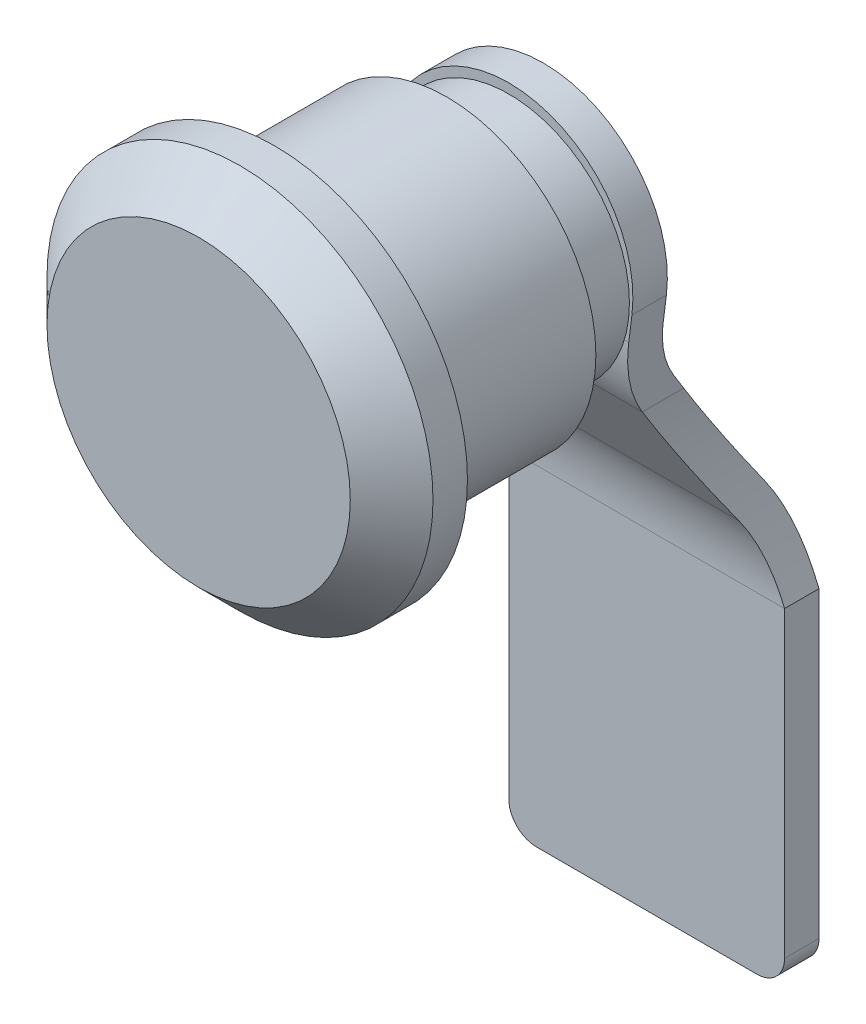
ISO-10303-21;
HEADER;
FILE_DESCRIPTION(('STEP AP214'),'2;1');
FILE_NAME('part.step','',(''),(''),'','','');
FILE_SCHEMA(('AUTOMOTIVE_DESIGN { 1 0 10303 214 1 1 1 1 }'));
ENDSEC;
DATA;
#1=APPLICATION_CONTEXT('core data for automotive mechanical design processes');
#2=APPLICATION_PROTOCOL_DEFINITION('international standard','automotive_design',2000,#1);
#3=PRODUCT_CONTEXT('',#1,'mechanical');
#4=PRODUCT('Part','Part','',(#3));
#5=PRODUCT_RELATED_PRODUCT_CATEGORY('part','',(#4));
#6=PRODUCT_DEFINITION_FORMATION('','',#4);
#7=PRODUCT_DEFINITION_CONTEXT('part definition',#1,'design');
#8=PRODUCT_DEFINITION('design','',#6,#7);
#9=PRODUCT_DEFINITION_SHAPE('','',#8);
#10=(LENGTH_UNIT() NAMED_UNIT(*) SI_UNIT(.MILLI.,.METRE.));
#11=(NAMED_UNIT(*) PLANE_ANGLE_UNIT() SI_UNIT($,.RADIAN.));
#12=(NAMED_UNIT(*) SI_UNIT($,.STERADIAN.) SOLID_ANGLE_UNIT());
#13=UNCERTAINTY_MEASURE_WITH_UNIT(LENGTH_MEASURE(1.E-05),#10,'distance_accuracy_value','');
#14=(GEOMETRIC_REPRESENTATION_CONTEXT(3) GLOBAL_UNCERTAINTY_ASSIGNED_CONTEXT((#13)) GLOBAL_UNIT_ASSIGNED_CONTEXT((#10,
#11,#12)) REPRESENTATION_CONTEXT('',''));
#15=CARTESIAN_POINT('',(0.,0.,0.));
#16=DIRECTION('',(0.,0.,1.));
#17=DIRECTION('',(1.,0.,0.));
#18=AXIS2_PLACEMENT_3D('',#15,#16,#17);
#19=CARTESIAN_POINT('',(0.,47.55,14.5));
#20=DIRECTION('',(0.,0.,-1.));
#21=DIRECTION('',(-1.,0.,0.));
#22=AXIS2_PLACEMENT_3D('',#19,#20,#21);
#23=CYLINDRICAL_SURFACE('',#22,8.75);
#24=CARTESIAN_POINT('',(0.,47.55,14.5));
#25=DIRECTION('',(0.,0.,1.));
#26=DIRECTION('',(1.,0.,0.));
#27=AXIS2_PLACEMENT_3D('',#24,#25,#26);
#28=CIRCLE('',#27,8.75);
#29=CARTESIAN_POINT('',(8.75,47.55,14.5));
#30=VERTEX_POINT('',#29);
#31=EDGE_CURVE('E92',#30,#30,#28,.T.);
#32=ORIENTED_EDGE('',*,*,#31,.F.);
#33=EDGE_LOOP('',(#32));
#34=FACE_BOUND('',#33,.T.);
#35=CARTESIAN_POINT('',(0.,47.55,10.));
#36=DIRECTION('',(0.,0.,1.));
#37=DIRECTION('',(1.,0.,0.));
#38=AXIS2_PLACEMENT_3D('',#35,#36,#37);
#39=CIRCLE('',#38,8.75);
#40=CARTESIAN_POINT('',(8.75,47.55,10.));
#41=VERTEX_POINT('',#40);
#42=EDGE_CURVE('E93',#41,#41,#39,.T.);
#43=ORIENTED_EDGE('',*,*,#42,.T.);
#44=EDGE_LOOP('',(#43));
#45=FACE_BOUND('',#44,.T.);
#46=ADVANCED_FACE('F79',(#34,#45),#23,.T.);
#47=CARTESIAN_POINT('',(0.,47.55,10.));
#48=DIRECTION('',(0.,0.,1.));
#49=DIRECTION('',(1.,0.,0.));
#50=AXIS2_PLACEMENT_3D('',#47,#48,#49);
#51=PLANE('',#50);
#52=ORIENTED_EDGE('',*,*,#42,.F.);
#53=EDGE_LOOP('',(#52));
#54=FACE_BOUND('',#53,.T.);
#55=ADVANCED_FACE('F126',(#54),#51,.F.);
#56=CARTESIAN_POINT('',(0.,47.55,27.));
#57=DIRECTION('',(0.,0.,-1.));
#58=DIRECTION('',(-1.,0.,0.));
#59=AXIS2_PLACEMENT_3D('',#56,#57,#58);
#60=CYLINDRICAL_SURFACE('',#59,10.815);
#61=CARTESIAN_POINT('',(0.,47.55,27.));
#62=DIRECTION('',(0.,0.,1.));
#63=DIRECTION('',(1.,0.,0.));
#64=AXIS2_PLACEMENT_3D('',#61,#62,#63);
#65=CIRCLE('',#64,10.815);
#66=CARTESIAN_POINT('',(10.815,47.55,27.));
#67=VERTEX_POINT('',#66);
#68=EDGE_CURVE('E100',#67,#67,#65,.T.);
#69=ORIENTED_EDGE('',*,*,#68,.F.);
#70=EDGE_LOOP('',(#69));
#71=FACE_BOUND('',#70,.T.);
#72=CARTESIAN_POINT('',(0.,47.55,14.5));
#73=DIRECTION('',(0.,0.,1.));
#74=DIRECTION('',(1.,0.,0.));
#75=AXIS2_PLACEMENT_3D('',#72,#73,#74);
#76=CIRCLE('',#75,10.815);
#77=CARTESIAN_POINT('',(10.815,47.55,14.5));
#78=VERTEX_POINT('',#77);
#79=EDGE_CURVE('E103',#78,#78,#76,.T.);
#80=ORIENTED_EDGE('',*,*,#79,.T.);
#81=EDGE_LOOP('',(#80));
#82=FACE_BOUND('',#81,.T.);
#83=ADVANCED_FACE('F135',(#71,#82),#60,.T.);
#84=CARTESIAN_POINT('',(0.,47.55,14.5));
#85=DIRECTION('',(0.,0.,1.));
#86=DIRECTION('',(1.,0.,0.));
#87=AXIS2_PLACEMENT_3D('',#84,#85,#86);
#88=PLANE('',#87);
#89=ORIENTED_EDGE('',*,*,#31,.T.);
#90=EDGE_LOOP('',(#89));
#91=FACE_BOUND('',#90,.T.);
#92=ORIENTED_EDGE('',*,*,#79,.F.);
#93=EDGE_LOOP('',(#92));
#94=FACE_BOUND('',#93,.T.);
#95=ADVANCED_FACE('F138',(#91,#94),#88,.F.);
#96=CARTESIAN_POINT('',(0.,47.55,32.5));
#97=DIRECTION('',(0.,0.,-1.));
#98=DIRECTION('',(-1.,0.,0.));
#99=AXIS2_PLACEMENT_3D('',#96,#97,#98);
#100=CYLINDRICAL_SURFACE('',#99,14.);
#101=CARTESIAN_POINT('',(0.,47.55,29.5));
#102=DIRECTION('',(0.,0.,1.));
#103=DIRECTION('',(1.,0.,0.));
#104=AXIS2_PLACEMENT_3D('',#101,#102,#103);
#105=CIRCLE('',#104,14.);
#106=CARTESIAN_POINT('',(14.,47.55,29.5));
#107=VERTEX_POINT('',#106);
#108=EDGE_CURVE('E12',#107,#107,#105,.F.);
#109=ORIENTED_EDGE('',*,*,#108,.T.);
#110=EDGE_LOOP('',(#109));
#111=FACE_BOUND('',#110,.T.);
#112=CARTESIAN_POINT('',(0.,47.55,27.));
#113=DIRECTION('',(0.,0.,1.));
#114=DIRECTION('',(1.,0.,0.));
#115=AXIS2_PLACEMENT_3D('',#112,#113,#114);
#116=CIRCLE('',#115,14.);
#117=CARTESIAN_POINT('',(14.,47.55,27.));
#118=VERTEX_POINT('',#117);
#119=EDGE_CURVE('E104',#118,#118,#116,.T.);
#120=ORIENTED_EDGE('',*,*,#119,.T.);
#121=EDGE_LOOP('',(#120));
#122=FACE_BOUND('',#121,.T.);
#123=ADVANCED_FACE('F109',(#111,#122),#100,.T.);
#124=CARTESIAN_POINT('',(0.,47.55,32.5));
#125=DIRECTION('',(0.,0.,1.));
#126=DIRECTION('',(1.,0.,0.));
#127=AXIS2_PLACEMENT_3D('',#124,#125,#126);
#128=PLANE('',#127);
#129=CARTESIAN_POINT('',(0.,47.55,32.5));
#130=DIRECTION('',(0.,0.,1.));
#131=DIRECTION('',(1.,0.,0.));
#132=AXIS2_PLACEMENT_3D('',#129,#130,#131);
#133=CIRCLE('',#132,11.);
#134=CARTESIAN_POINT('',(11.,47.55,32.5));
#135=VERTEX_POINT('',#134);
#136=EDGE_CURVE('E90',#135,#135,#133,.T.);
#137=ORIENTED_EDGE('',*,*,#136,.T.);
#138=EDGE_LOOP('',(#137));
#139=FACE_BOUND('',#138,.T.);
#140=ADVANCED_FACE('F112',(#139),#128,.T.);
#141=CARTESIAN_POINT('',(0.,47.55,27.));
#142=DIRECTION('',(0.,0.,1.));
#143=DIRECTION('',(1.,0.,0.));
#144=AXIS2_PLACEMENT_3D('',#141,#142,#143);
#145=PLANE('',#144);
#146=ORIENTED_EDGE('',*,*,#68,.T.);
#147=EDGE_LOOP('',(#146));
#148=FACE_BOUND('',#147,.T.);
#149=ORIENTED_EDGE('',*,*,#119,.F.);
#150=EDGE_LOOP('',(#149));
#151=FACE_BOUND('',#150,.T.);
#152=ADVANCED_FACE('F115',(#148,#151),#145,.F.);
#153=CARTESIAN_POINT('',(0.,47.55,32.5));
#154=DIRECTION('',(0.,0.,-1.));
#155=DIRECTION('',(-1.,0.,0.));
#156=AXIS2_PLACEMENT_3D('',#153,#154,#155);
#157=CONICAL_SURFACE('',#156,11.,0.785398163397447);
#158=ORIENTED_EDGE('',*,*,#108,.F.);
#159=EDGE_LOOP('',(#158));
#160=FACE_BOUND('',#159,.T.);
#161=ORIENTED_EDGE('',*,*,#136,.F.);
#162=EDGE_LOOP('',(#161));
#163=FACE_BOUND('',#162,.T.);
#164=ADVANCED_FACE('F81',(#160,#163),#157,.T.);
#165=CLOSED_SHELL('',(#46,#55,#83,#95,#123,#140,#152,#164));
#166=MANIFOLD_SOLID_BREP('B2',#165);
#167=CARTESIAN_POINT('',(10.,45.0277563773199,7.5));
#168=DIRECTION('',(0.,0.,-1.));
#169=DIRECTION('',(-1.,0.,0.));
#170=AXIS2_PLACEMENT_3D('',#167,#168,#169);
#171=PLANE('',#170);
#172=DIRECTION('',(0.,1.,0.));
#173=VECTOR('',#172,1.);
#174=CARTESIAN_POINT('',(-4.75,45.0277563773199,7.5));
#175=LINE('',#174,#173);
#176=CARTESIAN_POINT('',(-4.75,45.0277563773199,7.5));
#177=VERTEX_POINT('',#176);
#178=CARTESIAN_POINT('',(-4.75,52.3,7.5));
#179=VERTEX_POINT('',#178);
#180=EDGE_CURVE('E376',#177,#179,#175,.T.);
#181=ORIENTED_EDGE('',*,*,#180,.F.);
#182=DIRECTION('',(-1.,0.,0.));
#183=VECTOR('',#182,1.);
#184=CARTESIAN_POINT('',(10.,45.0277563773199,7.5));
#185=LINE('',#184,#183);
#186=CARTESIAN_POINT('',(-8.69722392769343,45.0277563773199,7.5));
#187=VERTEX_POINT('',#186);
#188=EDGE_CURVE('E483',#177,#187,#185,.T.);
#189=ORIENTED_EDGE('',*,*,#188,.T.);
#190=DIRECTION('',(-0.124712528953601,0.992192917290784,0.));
#191=VECTOR('',#190,1.);
#192=CARTESIAN_POINT('',(-8.40642198632387,42.714182681219,7.5));
#193=LINE('',#192,#191);
#194=CARTESIAN_POINT('',(-8.92973625561706,46.8775872394176,7.5));
#195=VERTEX_POINT('',#194);
#196=EDGE_CURVE('E391',#187,#195,#193,.T.);
#197=ORIENTED_EDGE('',*,*,#196,.T.);
#198=CARTESIAN_POINT('',(0.,48.,7.5));
#199=DIRECTION('',(0.,0.,-1.));
#200=DIRECTION('',(-1.,0.,0.));
#201=AXIS2_PLACEMENT_3D('',#198,#199,#200);
#202=CIRCLE('',#201,9.);
#203=CARTESIAN_POINT('',(8.92973625561706,46.8775872394176,7.5));
#204=VERTEX_POINT('',#203);
#205=EDGE_CURVE('E553',#195,#204,#202,.T.);
#206=ORIENTED_EDGE('',*,*,#205,.T.);
#207=DIRECTION('',(0.124712528953601,0.992192917290784,0.));
#208=VECTOR('',#207,1.);
#209=CARTESIAN_POINT('',(8.71748628388393,45.1889604397227,7.5));
#210=LINE('',#209,#208);
#211=CARTESIAN_POINT('',(8.69722392769343,45.0277563773199,7.5));
#212=VERTEX_POINT('',#211);
#213=EDGE_CURVE('E498',#212,#204,#210,.T.);
#214=ORIENTED_EDGE('',*,*,#213,.F.);
#215=CARTESIAN_POINT('',(4.75,45.0277563773199,7.5));
#216=VERTEX_POINT('',#215);
#217=EDGE_CURVE('E482',#212,#216,#185,.T.);
#218=ORIENTED_EDGE('',*,*,#217,.T.);
#219=DIRECTION('',(0.,-1.,0.));
#220=VECTOR('',#219,1.);
#221=CARTESIAN_POINT('',(4.75,45.0277563773199,7.5));
#222=LINE('',#221,#220);
#223=CARTESIAN_POINT('',(4.75,52.3,7.5));
#224=VERTEX_POINT('',#223);
#225=EDGE_CURVE('E375',#224,#216,#222,.T.);
#226=ORIENTED_EDGE('',*,*,#225,.F.);
#227=DIRECTION('',(1.,0.,0.));
#228=VECTOR('',#227,1.);
#229=CARTESIAN_POINT('',(10.,52.3,7.5));
#230=LINE('',#229,#228);
#231=EDGE_CURVE('E350',#179,#224,#230,.T.);
#232=ORIENTED_EDGE('',*,*,#231,.F.);
#233=EDGE_LOOP('',(#181,#189,#197,#206,#214,#218,#226,#232));
#234=FACE_BOUND('',#233,.T.);
#235=ADVANCED_FACE('F196',(#234),#171,.T.);
#236=CARTESIAN_POINT('',(10.,45.0277563773199,10.));
#237=DIRECTION('',(0.,0.,1.));
#238=DIRECTION('',(1.,0.,0.));
#239=AXIS2_PLACEMENT_3D('',#236,#237,#238);
#240=PLANE('',#239);
#241=DIRECTION('',(0.,-1.,0.));
#242=VECTOR('',#241,1.);
#243=CARTESIAN_POINT('',(-4.75,52.3,10.));
#244=LINE('',#243,#242);
#245=CARTESIAN_POINT('',(-4.75,52.3,10.));
#246=VERTEX_POINT('',#245);
#247=CARTESIAN_POINT('',(-4.75,45.0277563773199,10.));
#248=VERTEX_POINT('',#247);
#249=EDGE_CURVE('E356',#246,#248,#244,.T.);
#250=ORIENTED_EDGE('',*,*,#249,.F.);
#251=DIRECTION('',(-1.,0.,0.));
#252=VECTOR('',#251,1.);
#253=CARTESIAN_POINT('',(-4.75,52.3,10.));
#254=LINE('',#253,#252);
#255=CARTESIAN_POINT('',(4.75,52.3,10.));
#256=VERTEX_POINT('',#255);
#257=EDGE_CURVE('E343',#256,#246,#254,.T.);
#258=ORIENTED_EDGE('',*,*,#257,.F.);
#259=DIRECTION('',(0.,1.,0.));
#260=VECTOR('',#259,1.);
#261=CARTESIAN_POINT('',(4.75,52.3,10.));
#262=LINE('',#261,#260);
#263=CARTESIAN_POINT('',(4.75,45.0277563773199,10.));
#264=VERTEX_POINT('',#263);
#265=EDGE_CURVE('E354',#264,#256,#262,.T.);
#266=ORIENTED_EDGE('',*,*,#265,.F.);
#267=DIRECTION('',(1.,0.,0.));
#268=VECTOR('',#267,1.);
#269=CARTESIAN_POINT('',(10.,45.0277563773199,10.));
#270=LINE('',#269,#268);
#271=CARTESIAN_POINT('',(8.69722392769343,45.0277563773199,10.));
#272=VERTEX_POINT('',#271);
#273=EDGE_CURVE('E481',#264,#272,#270,.T.);
#274=ORIENTED_EDGE('',*,*,#273,.T.);
#275=DIRECTION('',(-0.124712528953601,-0.992192917290784,0.));
#276=VECTOR('',#275,1.);
#277=CARTESIAN_POINT('',(2.99026963520817,-0.375858446438275,10.));
#278=LINE('',#277,#276);
#279=CARTESIAN_POINT('',(8.92973625561706,46.8775872394176,10.));
#280=VERTEX_POINT('',#279);
#281=EDGE_CURVE('E537',#280,#272,#278,.T.);
#282=ORIENTED_EDGE('',*,*,#281,.F.);
#283=CARTESIAN_POINT('',(0.,48.,10.));
#284=DIRECTION('',(0.,0.,1.));
#285=DIRECTION('',(1.,0.,0.));
#286=AXIS2_PLACEMENT_3D('',#283,#284,#285);
#287=CIRCLE('',#286,9.);
#288=CARTESIAN_POINT('',(-8.92973625561706,46.8775872394176,10.));
#289=VERTEX_POINT('',#288);
#290=EDGE_CURVE('E435',#280,#289,#287,.T.);
#291=ORIENTED_EDGE('',*,*,#290,.T.);
#292=DIRECTION('',(0.124712528953601,-0.992192917290784,0.));
#293=VECTOR('',#292,1.);
#294=CARTESIAN_POINT('',(-2.99026963520817,-0.375858446438275,10.));
#295=LINE('',#294,#293);
#296=CARTESIAN_POINT('',(-8.69722392769343,45.0277563773199,10.));
#297=VERTEX_POINT('',#296);
#298=EDGE_CURVE('E378',#289,#297,#295,.T.);
#299=ORIENTED_EDGE('',*,*,#298,.T.);
#300=EDGE_CURVE('E496',#297,#248,#270,.T.);
#301=ORIENTED_EDGE('',*,*,#300,.T.);
#302=EDGE_LOOP('',(#250,#258,#266,#274,#282,#291,#299,#301));
#303=FACE_BOUND('',#302,.T.);
#304=ADVANCED_FACE('F359',(#303),#240,.T.);
#305=CARTESIAN_POINT('',(0.,23.9722436226801,10.));
#306=DIRECTION('',(1.,0.,0.));
#307=DIRECTION('',(0.,0.,-1.));
#308=AXIS2_PLACEMENT_3D('',#305,#306,#307);
#309=CYLINDRICAL_SURFACE('',#308,12.5);
#310=DIRECTION('',(-1.,0.,0.));
#311=VECTOR('',#310,1.);
#312=CARTESIAN_POINT('',(10.,23.97224362268,-2.5));
#313=LINE('',#312,#311);
#314=CARTESIAN_POINT('',(10.,23.97224362268,-2.5));
#315=VERTEX_POINT('',#314);
#316=CARTESIAN_POINT('',(-10.,23.97224362268,-2.5));
#317=VERTEX_POINT('',#316);
#318=EDGE_CURVE('E465',#315,#317,#313,.T.);
#319=ORIENTED_EDGE('',*,*,#318,.T.);
#320=CARTESIAN_POINT('',(-10.,23.97224362268,-2.5));
#321=CARTESIAN_POINT('',(-9.93490756182299,24.1344819645482,-2.49999977143485));
#322=CARTESIAN_POINT('',(-9.87118805263804,24.2972527151614,-2.49684075597756));
#323=CARTESIAN_POINT('',(-9.74656835922448,24.6236316161997,-2.48408494208752));
#324=CARTESIAN_POINT('',(-9.68566837600438,24.7872398254078,-2.47448768541545));
#325=CARTESIAN_POINT('',(-9.50729439464097,25.2790195403591,-2.43585299479659));
#326=CARTESIAN_POINT('',(-9.39417616928577,25.6080718079003,-2.39697253004292));
#327=CARTESIAN_POINT('',(-9.18296304180481,26.2572599729211,-2.29365426204652));
#328=CARTESIAN_POINT('',(-9.08455340010249,26.5774047159925,-2.22990904795546));
#329=CARTESIAN_POINT('',(-8.89961404933422,27.2148473250927,-2.07654373595993));
#330=CARTESIAN_POINT('',(-8.81308066014814,27.5321460444108,-1.98693168030128));
#331=CARTESIAN_POINT('',(-8.66483416703809,28.1108006646216,-1.79828495352514));
#332=CARTESIAN_POINT('',(-8.60136656174937,28.3729611862488,-1.70307146308777));
#333=CARTESIAN_POINT('',(-8.48265835773092,28.8919044784615,-1.49456949715528));
#334=CARTESIAN_POINT('',(-8.42741745691517,29.1486874462139,-1.38128168566896));
#335=CARTESIAN_POINT('',(-8.32376080753186,29.6609789487687,-1.13422229002246));
#336=CARTESIAN_POINT('',(-8.27552551471736,29.9163302924956,-1.00004895348743));
#337=CARTESIAN_POINT('',(-8.18694350252523,30.4182005943638,-0.713698273211968));
#338=CARTESIAN_POINT('',(-8.14659789882116,30.6647182993288,-0.561518388058976));
#339=CARTESIAN_POINT('',(-8.10998146575407,30.9059960754955,-0.400628679223022));
#340=B_SPLINE_CURVE_WITH_KNOTS('',3,(#320,#321,#322,#323,#324,#325,#326,#327,#328,#329,#330,
#331,#332,#333,#334,#335,#336,#337,#338,#339),.UNSPECIFIED.,.F.,.F.,(4,2,2,2,2,2,2,2,2,4),(0.,
0.524356550499981,1.04875042583385,2.09777769206142,3.11946121264182,4.14082742366034,
4.99825307297295,5.85564722969835,6.73223361565664,7.60894386938037),.UNSPECIFIED.);
#341=CARTESIAN_POINT('',(-8.10998146575407,30.9059960754955,-0.400628679223021));
#342=VERTEX_POINT('',#341);
#343=EDGE_CURVE('E425',#317,#342,#340,.T.);
#344=ORIENTED_EDGE('',*,*,#343,.T.);
#345=DIRECTION('',(-1.,0.,0.));
#346=VECTOR('',#345,1.);
#347=CARTESIAN_POINT('',(10.,30.9059960754955,-0.400628679223021));
#348=LINE('',#347,#346);
#349=CARTESIAN_POINT('',(8.10998146575407,30.9059960754955,-0.400628679223021));
#350=VERTEX_POINT('',#349);
#351=EDGE_CURVE('E471',#350,#342,#348,.T.);
#352=ORIENTED_EDGE('',*,*,#351,.F.);
#353=CARTESIAN_POINT('',(10.,23.97224362268,-2.5));
#354=CARTESIAN_POINT('',(9.93490756182299,24.1344819645482,-2.49999977143485));
#355=CARTESIAN_POINT('',(9.87118805263805,24.2972527151614,-2.49684075597756));
#356=CARTESIAN_POINT('',(9.74656835922449,24.6236316161997,-2.48408494208752));
#357=CARTESIAN_POINT('',(9.68566837600438,24.7872398254078,-2.47448768541545));
#358=CARTESIAN_POINT('',(9.50729439464097,25.2790195403591,-2.43585299479659));
#359=CARTESIAN_POINT('',(9.39417616928576,25.6080718079003,-2.39697253004293));
#360=CARTESIAN_POINT('',(9.18296304180481,26.2572599729211,-2.29365426204652));
#361=CARTESIAN_POINT('',(9.0845534001025,26.5774047159925,-2.22990904795546));
#362=CARTESIAN_POINT('',(8.89961404933423,27.2148473250927,-2.07654373595993));
#363=CARTESIAN_POINT('',(8.81308066014813,27.5321460444108,-1.98693168030129));
#364=CARTESIAN_POINT('',(8.66483416703809,28.1108006646216,-1.79828495352515));
#365=CARTESIAN_POINT('',(8.60136656174937,28.3729611862488,-1.70307146308778));
#366=CARTESIAN_POINT('',(8.48265835773092,28.8919044784615,-1.49456949715528));
#367=CARTESIAN_POINT('',(8.42741745691517,29.1486874462139,-1.38128168566896));
#368=CARTESIAN_POINT('',(8.32376080753186,29.6609789487687,-1.13422229002246));
#369=CARTESIAN_POINT('',(8.27552551471736,29.9163302924956,-1.00004895348743));
#370=CARTESIAN_POINT('',(8.18694350252523,30.4182005943638,-0.713698273211968));
#371=CARTESIAN_POINT('',(8.14659789882116,30.6647182993288,-0.561518388058976));
#372=CARTESIAN_POINT('',(8.10998146575407,30.9059960754955,-0.400628679223023));
#373=B_SPLINE_CURVE_WITH_KNOTS('',3,(#353,#354,#355,#356,#357,#358,#359,#360,#361,#362,#363,
#364,#365,#366,#367,#368,#369,#370,#371,#372),.UNSPECIFIED.,.F.,.F.,(4,2,2,2,2,2,2,2,2,4),(0.,
0.524356550499974,1.04875042583386,2.09777769206142,3.11946121264181,4.14082742366034,
4.99825307297295,5.85564722969835,6.73223361565664,7.60894386938037),.UNSPECIFIED.);
#374=EDGE_CURVE('E447',#315,#350,#373,.T.);
#375=ORIENTED_EDGE('',*,*,#374,.F.);
#376=EDGE_LOOP('',(#319,#344,#352,#375));
#377=FACE_BOUND('',#376,.T.);
#378=ADVANCED_FACE('F432',(#377),#309,.T.);
#379=CARTESIAN_POINT('',(0.,23.9722436226801,10.));
#380=DIRECTION('',(1.,0.,0.));
#381=DIRECTION('',(0.,0.,-1.));
#382=AXIS2_PLACEMENT_3D('',#379,#380,#381);
#383=CYLINDRICAL_SURFACE('',#382,10.);
#384=DIRECTION('',(1.,0.,0.));
#385=VECTOR('',#384,1.);
#386=CARTESIAN_POINT('',(10.,29.5192455849324,1.67949705662158));
#387=LINE('',#386,#385);
#388=CARTESIAN_POINT('',(-8.35267227884698,29.5192455849324,1.67949705662158));
#389=VERTEX_POINT('',#388);
#390=CARTESIAN_POINT('',(8.35267227884699,29.5192455849324,1.67949705662158));
#391=VERTEX_POINT('',#390);
#392=EDGE_CURVE('E472',#389,#391,#387,.T.);
#393=ORIENTED_EDGE('',*,*,#392,.F.);
#394=CARTESIAN_POINT('',(-8.35267227884699,29.5192455849324,1.67949705662158));
#395=CARTESIAN_POINT('',(-8.37587313975076,29.4022775494015,1.60151770254961));
#396=CARTESIAN_POINT('',(-8.40006847066348,29.2838171216168,1.52610818259121));
#397=CARTESIAN_POINT('',(-8.45050943884631,29.044152940039,1.38052220800878));
#398=CARTESIAN_POINT('',(-8.47675502656714,28.9229492525936,1.31034562699852));
#399=CARTESIAN_POINT('',(-8.55864067362372,28.5556679180599,1.10785010688917));
#400=CARTESIAN_POINT('',(-8.61744677367712,28.3058326851131,0.983507283387561));
#401=CARTESIAN_POINT('',(-8.74218039902371,27.8048127205821,0.759606190298752));
#402=CARTESIAN_POINT('',(-8.80789665493904,27.5538130519236,0.659512545498794));
#403=CARTESIAN_POINT('',(-8.94766729965198,27.0466570497182,0.480532729519926));
#404=CARTESIAN_POINT('',(-9.02172036859121,26.790501537687,0.401643208050352));
#405=CARTESIAN_POINT('',(-9.16354388883231,26.3229684829209,0.277796374733424));
#406=CARTESIAN_POINT('',(-9.22992807393212,26.1121073217009,0.229258476829012));
#407=CARTESIAN_POINT('',(-9.3680329667808,25.6893755997834,0.146175684543416));
#408=CARTESIAN_POINT('',(-9.43975362835667,25.4775050478342,0.111630669107765));
#409=CARTESIAN_POINT('',(-9.58987172676016,25.0494016582394,0.055791868887777));
#410=CARTESIAN_POINT('',(-9.66837641566692,24.8331690385188,0.0347862946704298));
#411=CARTESIAN_POINT('',(-9.83045552682933,24.4017104696181,0.00688492251670608));
#412=CARTESIAN_POINT('',(-9.91402957620742,24.1864844476489,-1.19118974128439E-05));
#413=CARTESIAN_POINT('',(-10.,23.97224362268,0.));
#414=B_SPLINE_CURVE_WITH_KNOTS('',3,(#394,#395,#396,#397,#398,#399,#400,#401,#402,#403,#404,
#405,#406,#407,#408,#409,#410,#411,#412,#413),.UNSPECIFIED.,.F.,.F.,(4,2,2,2,2,2,2,2,2,4),(0.,
0.42736746236196,0.854724599576224,1.70912115375651,2.54245731580059,3.37566173168752,
4.05416891133887,4.73267022100028,5.42517527337947,6.11762945007004),.UNSPECIFIED.);
#415=CARTESIAN_POINT('',(-10.,23.97224362268,0.));
#416=VERTEX_POINT('',#415);
#417=EDGE_CURVE('E397',#389,#416,#414,.T.);
#418=ORIENTED_EDGE('',*,*,#417,.T.);
#419=DIRECTION('',(1.,0.,0.));
#420=VECTOR('',#419,1.);
#421=CARTESIAN_POINT('',(10.,23.97224362268,0.));
#422=LINE('',#421,#420);
#423=CARTESIAN_POINT('',(10.,23.97224362268,0.));
#424=VERTEX_POINT('',#423);
#425=EDGE_CURVE('E478',#416,#424,#422,.T.);
#426=ORIENTED_EDGE('',*,*,#425,.T.);
#427=CARTESIAN_POINT('',(8.35267227884699,29.5192455849324,1.67949705662158));
#428=CARTESIAN_POINT('',(8.37587313975076,29.4022775494015,1.60151770254961));
#429=CARTESIAN_POINT('',(8.40006847066348,29.2838171216168,1.52610818259121));
#430=CARTESIAN_POINT('',(8.45050943884632,29.044152940039,1.38052220800878));
#431=CARTESIAN_POINT('',(8.47675502656714,28.9229492525936,1.31034562699852));
#432=CARTESIAN_POINT('',(8.55864067362372,28.5556679180599,1.10785010688917));
#433=CARTESIAN_POINT('',(8.61744677367712,28.3058326851131,0.98350728338756));
#434=CARTESIAN_POINT('',(8.7421803990237,27.8048127205821,0.759606190298753));
#435=CARTESIAN_POINT('',(8.80789665493904,27.5538130519236,0.659512545498796));
#436=CARTESIAN_POINT('',(8.94766729965199,27.0466570497182,0.480532729519928));
#437=CARTESIAN_POINT('',(9.02172036859121,26.790501537687,0.401643208050353));
#438=CARTESIAN_POINT('',(9.16354388883231,26.3229684829209,0.277796374733423));
#439=CARTESIAN_POINT('',(9.22992807393213,26.1121073217009,0.229258476829011));
#440=CARTESIAN_POINT('',(9.3680329667808,25.6893755997834,0.146175684543416));
#441=CARTESIAN_POINT('',(9.43975362835667,25.4775050478342,0.111630669107767));
#442=CARTESIAN_POINT('',(9.58987172676015,25.0494016582394,0.0557918688877789));
#443=CARTESIAN_POINT('',(9.66837641566692,24.8331690385188,0.0347862946704306));
#444=CARTESIAN_POINT('',(9.83045552682933,24.4017104696181,0.00688492251670497));
#445=CARTESIAN_POINT('',(9.91402957620742,24.1864844476489,-1.19118974146701E-05));
#446=CARTESIAN_POINT('',(10.,23.97224362268,0.));
#447=B_SPLINE_CURVE_WITH_KNOTS('',3,(#427,#428,#429,#430,#431,#432,#433,#434,#435,#436,#437,
#438,#439,#440,#441,#442,#443,#444,#445,#446),.UNSPECIFIED.,.F.,.F.,(4,2,2,2,2,2,2,2,2,4),(0.,
0.427367462361961,0.854724599576221,1.70912115375651,2.54245731580059,3.37566173168752,
4.05416891133887,4.73267022100027,5.42517527337946,6.11762945007003),.UNSPECIFIED.);
#448=EDGE_CURVE('E559',#391,#424,#447,.T.);
#449=ORIENTED_EDGE('',*,*,#448,.F.);
#450=EDGE_LOOP('',(#393,#418,#426,#449));
#451=FACE_BOUND('',#450,.T.);
#452=ADVANCED_FACE('F406',(#451),#383,.F.);
#453=CARTESIAN_POINT('',(10.,30.9059960754955,-0.400628679223026));
#454=DIRECTION('',(0.,0.554700196225229,-0.832050294337844));
#455=DIRECTION('',(0.,0.832050294337844,0.554700196225229));
#456=AXIS2_PLACEMENT_3D('',#453,#454,#455);
#457=PLANE('',#456);
#458=CARTESIAN_POINT('',(-38.9564242613068,35.589722852849,2.72185583901269));
#459=DIRECTION('',(0.,0.554700196225229,-0.832050294337844));
#460=DIRECTION('',(0.,0.832050294337844,0.554700196225229));
#461=AXIS2_PLACEMENT_3D('',#458,#459,#460);
#462=ELLIPSE('',#461,37.4977396142971,31.2000052830797);
#463=CARTESIAN_POINT('',(-8.,39.4807544150676,5.31587688049175));
#464=VERTEX_POINT('',#463);
#465=EDGE_CURVE('E403',#342,#464,#462,.F.);
#466=ORIENTED_EDGE('',*,*,#465,.T.);
#467=DIRECTION('',(-0.104016285316467,0.827536915816154,0.55169127721077));
#468=VECTOR('',#467,1.);
#469=CARTESIAN_POINT('',(-6.73911787013854,29.4493780226243,-1.37170738113713));
#470=LINE('',#469,#468);
#471=CARTESIAN_POINT('',(-8.17430598192336,40.8675049056307,6.2403772075338));
#472=VERTEX_POINT('',#471);
#473=EDGE_CURVE('E387',#464,#472,#470,.T.);
#474=ORIENTED_EDGE('',*,*,#473,.T.);
#475=DIRECTION('',(-1.,0.,0.));
#476=VECTOR('',#475,1.);
#477=CARTESIAN_POINT('',(10.,40.8675049056307,6.2403772075338));
#478=LINE('',#477,#476);
#479=CARTESIAN_POINT('',(8.17430598192336,40.8675049056307,6.2403772075338));
#480=VERTEX_POINT('',#479);
#481=EDGE_CURVE('E480',#480,#472,#478,.T.);
#482=ORIENTED_EDGE('',*,*,#481,.F.);
#483=DIRECTION('',(0.104016285316467,0.827536915816154,0.55169127721077));
#484=VECTOR('',#483,1.);
#485=CARTESIAN_POINT('',(6.95550562235927,31.1709243415331,-0.224009835197903));
#486=LINE('',#485,#484);
#487=CARTESIAN_POINT('',(8.,39.4807544150676,5.31587688049175));
#488=VERTEX_POINT('',#487);
#489=EDGE_CURVE('E560',#488,#480,#486,.T.);
#490=ORIENTED_EDGE('',*,*,#489,.F.);
#491=CARTESIAN_POINT('',(38.9564242613067,35.589722852849,2.72185583901269));
#492=DIRECTION('',(0.,0.554700196225229,-0.832050294337844));
#493=DIRECTION('',(0.,0.832050294337844,0.554700196225229));
#494=AXIS2_PLACEMENT_3D('',#491,#492,#493);
#495=ELLIPSE('',#494,37.4977396142971,31.2000052830797);
#496=EDGE_CURVE('E453',#350,#488,#495,.T.);
#497=ORIENTED_EDGE('',*,*,#496,.F.);
#498=ORIENTED_EDGE('',*,*,#351,.T.);
#499=EDGE_LOOP('',(#466,#474,#482,#490,#497,#498));
#500=FACE_BOUND('',#499,.T.);
#501=ADVANCED_FACE('F445',(#500),#457,.T.);
#502=CARTESIAN_POINT('',(10.,29.5192455849324,1.67949705662158));
#503=DIRECTION('',(0.,-0.554700196225229,0.832050294337844));
#504=DIRECTION('',(0.,-0.832050294337844,-0.554700196225229));
#505=AXIS2_PLACEMENT_3D('',#502,#503,#504);
#506=PLANE('',#505);
#507=DIRECTION('',(1.,0.,0.));
#508=VECTOR('',#507,1.);
#509=CARTESIAN_POINT('',(10.,39.4807544150676,8.32050294337841));
#510=LINE('',#509,#508);
#511=CARTESIAN_POINT('',(-8.,39.4807544150676,8.32050294337841));
#512=VERTEX_POINT('',#511);
#513=CARTESIAN_POINT('',(8.,39.4807544150676,8.32050294337842));
#514=VERTEX_POINT('',#513);
#515=EDGE_CURVE('E477',#512,#514,#510,.T.);
#516=ORIENTED_EDGE('',*,*,#515,.F.);
#517=CARTESIAN_POINT('',(-38.9564242613068,35.589722852849,5.72648190189935));
#518=DIRECTION('',(0.,-0.554700196225229,0.832050294337844));
#519=DIRECTION('',(0.,0.832050294337844,0.554700196225229));
#520=AXIS2_PLACEMENT_3D('',#517,#518,#519);
#521=ELLIPSE('',#520,37.4977396142971,31.2000052830797);
#522=EDGE_CURVE('E506',#512,#389,#521,.F.);
#523=ORIENTED_EDGE('',*,*,#522,.T.);
#524=ORIENTED_EDGE('',*,*,#392,.T.);
#525=CARTESIAN_POINT('',(38.9564242613067,35.589722852849,5.72648190189935));
#526=DIRECTION('',(0.,-0.554700196225229,0.832050294337844));
#527=DIRECTION('',(0.,0.832050294337844,0.554700196225229));
#528=AXIS2_PLACEMENT_3D('',#525,#526,#527);
#529=ELLIPSE('',#528,37.4977396142971,31.2000052830797);
#530=EDGE_CURVE('E499',#514,#391,#529,.T.);
#531=ORIENTED_EDGE('',*,*,#530,.F.);
#532=EDGE_LOOP('',(#516,#523,#524,#531));
#533=FACE_BOUND('',#532,.T.);
#534=ADVANCED_FACE('F629',(#533),#506,.T.);
#535=CARTESIAN_POINT('',(0.,45.0277563773199,0.));
#536=DIRECTION('',(-1.,0.,0.));
#537=DIRECTION('',(0.,0.,1.));
#538=AXIS2_PLACEMENT_3D('',#535,#536,#537);
#539=CYLINDRICAL_SURFACE('',#538,7.5);
#540=CARTESIAN_POINT('',(-4.75,45.0277563773199,0.));
#541=DIRECTION('',(-1.,0.,0.));
#542=DIRECTION('',(0.,-1.,0.));
#543=AXIS2_PLACEMENT_3D('',#540,#541,#542);
#544=CIRCLE('',#543,7.5);
#545=CARTESIAN_POINT('',(-4.75,42.8,7.16150134561953));
#546=VERTEX_POINT('',#545);
#547=EDGE_CURVE('E372',#546,#177,#544,.T.);
#548=ORIENTED_EDGE('',*,*,#547,.F.);
#549=DIRECTION('',(-1.,0.,0.));
#550=VECTOR('',#549,1.);
#551=CARTESIAN_POINT('',(0.,42.8,7.16150134561953));
#552=LINE('',#551,#550);
#553=CARTESIAN_POINT('',(4.75,42.8,7.16150134561953));
#554=VERTEX_POINT('',#553);
#555=EDGE_CURVE('E366',#554,#546,#552,.T.);
#556=ORIENTED_EDGE('',*,*,#555,.F.);
#557=CARTESIAN_POINT('',(4.75,45.0277563773199,0.));
#558=DIRECTION('',(1.,0.,0.));
#559=DIRECTION('',(0.,1.,0.));
#560=AXIS2_PLACEMENT_3D('',#557,#558,#559);
#561=CIRCLE('',#560,7.5);
#562=EDGE_CURVE('E369',#216,#554,#561,.T.);
#563=ORIENTED_EDGE('',*,*,#562,.F.);
#564=ORIENTED_EDGE('',*,*,#217,.F.);
#565=CARTESIAN_POINT('',(8.69722392769343,45.0277563773199,0.));
#566=DIRECTION('',(-0.992192917290784,0.124712528953601,0.));
#567=DIRECTION('',(-0.124712528953601,-0.992192917290784,0.));
#568=AXIS2_PLACEMENT_3D('',#565,#566,#567);
#569=ELLIPSE('',#568,7.55901384629816,7.5);
#570=EDGE_CURVE('E554',#480,#212,#569,.T.);
#571=ORIENTED_EDGE('',*,*,#570,.F.);
#572=ORIENTED_EDGE('',*,*,#481,.T.);
#573=CARTESIAN_POINT('',(-8.69722392769343,45.0277563773199,0.));
#574=DIRECTION('',(-0.992192917290784,-0.124712528953601,0.));
#575=DIRECTION('',(-0.124712528953601,0.992192917290784,0.));
#576=AXIS2_PLACEMENT_3D('',#573,#574,#575);
#577=ELLIPSE('',#576,7.55901384629816,7.5);
#578=EDGE_CURVE('E389',#472,#187,#577,.T.);
#579=ORIENTED_EDGE('',*,*,#578,.T.);
#580=ORIENTED_EDGE('',*,*,#188,.F.);
#581=EDGE_LOOP('',(#548,#556,#563,#564,#571,#572,#579,#580));
#582=FACE_BOUND('',#581,.T.);
#583=ADVANCED_FACE('F579',(#582),#539,.F.);
#584=CARTESIAN_POINT('',(0.,45.0277563773199,0.));
#585=DIRECTION('',(-1.,0.,0.));
#586=DIRECTION('',(0.,0.,1.));
#587=AXIS2_PLACEMENT_3D('',#584,#585,#586);
#588=CYLINDRICAL_SURFACE('',#587,10.);
#589=CARTESIAN_POINT('',(-4.75,45.0277563773199,0.));
#590=DIRECTION('',(-1.,0.,0.));
#591=DIRECTION('',(0.,-1.,0.));
#592=AXIS2_PLACEMENT_3D('',#589,#590,#591);
#593=CIRCLE('',#592,10.);
#594=CARTESIAN_POINT('',(-4.75,42.8,9.74869742700584));
#595=VERTEX_POINT('',#594);
#596=EDGE_CURVE('E80',#248,#595,#593,.F.);
#597=ORIENTED_EDGE('',*,*,#596,.F.);
#598=ORIENTED_EDGE('',*,*,#300,.F.);
#599=CARTESIAN_POINT('',(-8.69722392769343,45.0277563773199,0.));
#600=DIRECTION('',(-0.992192917290784,-0.124712528953601,0.));
#601=DIRECTION('',(-0.124712528953601,0.992192917290784,0.));
#602=AXIS2_PLACEMENT_3D('',#599,#600,#601);
#603=ELLIPSE('',#602,10.0786851283975,10.);
#604=EDGE_CURVE('E503',#297,#512,#603,.F.);
#605=ORIENTED_EDGE('',*,*,#604,.T.);
#606=ORIENTED_EDGE('',*,*,#515,.T.);
#607=CARTESIAN_POINT('',(8.69722392769343,45.0277563773199,0.));
#608=DIRECTION('',(-0.992192917290784,0.124712528953601,0.));
#609=DIRECTION('',(-0.124712528953601,-0.992192917290784,0.));
#610=AXIS2_PLACEMENT_3D('',#607,#608,#609);
#611=ELLIPSE('',#610,10.0786851283975,10.);
#612=EDGE_CURVE('E536',#272,#514,#611,.F.);
#613=ORIENTED_EDGE('',*,*,#612,.F.);
#614=ORIENTED_EDGE('',*,*,#273,.F.);
#615=CARTESIAN_POINT('',(4.75,45.0277563773199,0.));
#616=DIRECTION('',(1.,0.,0.));
#617=DIRECTION('',(0.,1.,0.));
#618=AXIS2_PLACEMENT_3D('',#615,#616,#617);
#619=CIRCLE('',#618,10.);
#620=CARTESIAN_POINT('',(4.75,42.8,9.74869742700584));
#621=VERTEX_POINT('',#620);
#622=EDGE_CURVE('E207',#621,#264,#619,.F.);
#623=ORIENTED_EDGE('',*,*,#622,.F.);
#624=DIRECTION('',(-1.,0.,0.));
#625=VECTOR('',#624,1.);
#626=CARTESIAN_POINT('',(0.,42.8,9.74869742700584));
#627=LINE('',#626,#625);
#628=EDGE_CURVE('E530',#595,#621,#627,.F.);
#629=ORIENTED_EDGE('',*,*,#628,.F.);
#630=EDGE_LOOP('',(#597,#598,#605,#606,#613,#614,#623,#629));
#631=FACE_BOUND('',#630,.T.);
#632=ADVANCED_FACE('F534',(#631),#588,.T.);
#633=CARTESIAN_POINT('',(0.,0.,0.));
#634=DIRECTION('',(0.,1.,0.));
#635=DIRECTION('',(0.,0.,1.));
#636=AXIS2_PLACEMENT_3D('',#633,#634,#635);
#637=PLANE('',#636);
#638=DIRECTION('',(-1.,0.,0.));
#639=VECTOR('',#638,1.);
#640=CARTESIAN_POINT('',(10.,0.,-2.5));
#641=LINE('',#640,#639);
#642=CARTESIAN_POINT('',(8.,0.,-2.5));
#643=VERTEX_POINT('',#642);
#644=CARTESIAN_POINT('',(-8.,0.,-2.5));
#645=VERTEX_POINT('',#644);
#646=EDGE_CURVE('E455',#643,#645,#641,.T.);
#647=ORIENTED_EDGE('',*,*,#646,.F.);
#648=DIRECTION('',(0.,0.,-1.));
#649=VECTOR('',#648,1.);
#650=CARTESIAN_POINT('',(8.,0.,0.));
#651=LINE('',#650,#649);
#652=CARTESIAN_POINT('',(8.,0.,0.));
#653=VERTEX_POINT('',#652);
#654=EDGE_CURVE('E520',#643,#653,#651,.F.);
#655=ORIENTED_EDGE('',*,*,#654,.T.);
#656=DIRECTION('',(1.,0.,0.));
#657=VECTOR('',#656,1.);
#658=CARTESIAN_POINT('',(10.,0.,0.));
#659=LINE('',#658,#657);
#660=CARTESIAN_POINT('',(-8.,0.,0.));
#661=VERTEX_POINT('',#660);
#662=EDGE_CURVE('E461',#661,#653,#659,.T.);
#663=ORIENTED_EDGE('',*,*,#662,.F.);
#664=DIRECTION('',(0.,0.,1.));
#665=VECTOR('',#664,1.);
#666=CARTESIAN_POINT('',(-8.,0.,-2.5));
#667=LINE('',#666,#665);
#668=EDGE_CURVE('E519',#661,#645,#667,.F.);
#669=ORIENTED_EDGE('',*,*,#668,.T.);
#670=EDGE_LOOP('',(#647,#655,#663,#669));
#671=FACE_BOUND('',#670,.T.);
#672=ADVANCED_FACE('F623',(#671),#637,.F.);
#673=CARTESIAN_POINT('',(10.,0.,0.));
#674=DIRECTION('',(1.,0.,0.));
#675=DIRECTION('',(0.,0.,-1.));
#676=AXIS2_PLACEMENT_3D('',#673,#674,#675);
#677=PLANE('',#676);
#678=DIRECTION('',(0.,1.,0.));
#679=VECTOR('',#678,1.);
#680=CARTESIAN_POINT('',(10.,0.,0.));
#681=LINE('',#680,#679);
#682=CARTESIAN_POINT('',(10.,2.,0.));
#683=VERTEX_POINT('',#682);
#684=EDGE_CURVE('E457',#683,#424,#681,.T.);
#685=ORIENTED_EDGE('',*,*,#684,.F.);
#686=DIRECTION('',(0.,0.,-1.));
#687=VECTOR('',#686,1.);
#688=CARTESIAN_POINT('',(10.,2.,-2.5));
#689=LINE('',#688,#687);
#690=CARTESIAN_POINT('',(10.,2.,-2.5));
#691=VERTEX_POINT('',#690);
#692=EDGE_CURVE('E508',#683,#691,#689,.T.);
#693=ORIENTED_EDGE('',*,*,#692,.T.);
#694=DIRECTION('',(0.,1.,0.));
#695=VECTOR('',#694,1.);
#696=CARTESIAN_POINT('',(10.,0.,-2.5));
#697=LINE('',#696,#695);
#698=EDGE_CURVE('E459',#691,#315,#697,.T.);
#699=ORIENTED_EDGE('',*,*,#698,.T.);
#700=DIRECTION('',(0.,0.,-1.));
#701=VECTOR('',#700,1.);
#702=CARTESIAN_POINT('',(10.,23.97224362268,0.));
#703=LINE('',#702,#701);
#704=EDGE_CURVE('E458',#424,#315,#703,.T.);
#705=ORIENTED_EDGE('',*,*,#704,.F.);
#706=EDGE_LOOP('',(#685,#693,#699,#705));
#707=FACE_BOUND('',#706,.T.);
#708=ADVANCED_FACE('F630',(#707),#677,.T.);
#709=CARTESIAN_POINT('',(10.,0.,-2.5));
#710=DIRECTION('',(0.,0.,-1.));
#711=DIRECTION('',(-1.,0.,0.));
#712=AXIS2_PLACEMENT_3D('',#709,#710,#711);
#713=PLANE('',#712);
#714=ORIENTED_EDGE('',*,*,#698,.F.);
#715=CARTESIAN_POINT('',(8.,2.,-2.5));
#716=DIRECTION('',(0.,0.,-1.));
#717=DIRECTION('',(-1.,0.,0.));
#718=AXIS2_PLACEMENT_3D('',#715,#716,#717);
#719=CIRCLE('',#718,2.);
#720=EDGE_CURVE('E511',#691,#643,#719,.T.);
#721=ORIENTED_EDGE('',*,*,#720,.T.);
#722=ORIENTED_EDGE('',*,*,#646,.T.);
#723=CARTESIAN_POINT('',(-8.,2.,-2.5));
#724=DIRECTION('',(0.,0.,-1.));
#725=DIRECTION('',(-1.,0.,0.));
#726=AXIS2_PLACEMENT_3D('',#723,#724,#725);
#727=CIRCLE('',#726,2.);
#728=CARTESIAN_POINT('',(-10.,2.,-2.5));
#729=VERTEX_POINT('',#728);
#730=EDGE_CURVE('E515',#645,#729,#727,.T.);
#731=ORIENTED_EDGE('',*,*,#730,.T.);
#732=DIRECTION('',(0.,1.,0.));
#733=VECTOR('',#732,1.);
#734=CARTESIAN_POINT('',(-10.,0.,-2.5));
#735=LINE('',#734,#733);
#736=EDGE_CURVE('E469',#729,#317,#735,.T.);
#737=ORIENTED_EDGE('',*,*,#736,.T.);
#738=ORIENTED_EDGE('',*,*,#318,.F.);
#739=EDGE_LOOP('',(#714,#721,#722,#731,#737,#738));
#740=FACE_BOUND('',#739,.T.);
#741=ADVANCED_FACE('F439',(#740),#713,.T.);
#742=CARTESIAN_POINT('',(-10.,0.,0.));
#743=DIRECTION('',(-1.,0.,0.));
#744=DIRECTION('',(0.,0.,1.));
#745=AXIS2_PLACEMENT_3D('',#742,#743,#744);
#746=PLANE('',#745);
#747=ORIENTED_EDGE('',*,*,#736,.F.);
#748=DIRECTION('',(0.,0.,1.));
#749=VECTOR('',#748,1.);
#750=CARTESIAN_POINT('',(-10.,2.,0.));
#751=LINE('',#750,#749);
#752=CARTESIAN_POINT('',(-10.,2.,0.));
#753=VERTEX_POINT('',#752);
#754=EDGE_CURVE('E524',#729,#753,#751,.T.);
#755=ORIENTED_EDGE('',*,*,#754,.T.);
#756=DIRECTION('',(0.,1.,0.));
#757=VECTOR('',#756,1.);
#758=CARTESIAN_POINT('',(-10.,0.,0.));
#759=LINE('',#758,#757);
#760=EDGE_CURVE('E486',#753,#416,#759,.T.);
#761=ORIENTED_EDGE('',*,*,#760,.T.);
#762=DIRECTION('',(0.,0.,1.));
#763=VECTOR('',#762,1.);
#764=CARTESIAN_POINT('',(-10.,23.97224362268,0.));
#765=LINE('',#764,#763);
#766=EDGE_CURVE('E474',#317,#416,#765,.T.);
#767=ORIENTED_EDGE('',*,*,#766,.F.);
#768=EDGE_LOOP('',(#747,#755,#761,#767));
#769=FACE_BOUND('',#768,.T.);
#770=ADVANCED_FACE('F607',(#769),#746,.T.);
#771=CARTESIAN_POINT('',(10.,0.,0.));
#772=DIRECTION('',(0.,0.,1.));
#773=DIRECTION('',(1.,0.,0.));
#774=AXIS2_PLACEMENT_3D('',#771,#772,#773);
#775=PLANE('',#774);
#776=ORIENTED_EDGE('',*,*,#662,.T.);
#777=CARTESIAN_POINT('',(8.,2.,0.));
#778=DIRECTION('',(0.,0.,1.));
#779=DIRECTION('',(1.,0.,0.));
#780=AXIS2_PLACEMENT_3D('',#777,#778,#779);
#781=CIRCLE('',#780,2.);
#782=EDGE_CURVE('E525',#653,#683,#781,.T.);
#783=ORIENTED_EDGE('',*,*,#782,.T.);
#784=ORIENTED_EDGE('',*,*,#684,.T.);
#785=ORIENTED_EDGE('',*,*,#425,.F.);
#786=ORIENTED_EDGE('',*,*,#760,.F.);
#787=CARTESIAN_POINT('',(-8.,2.,0.));
#788=DIRECTION('',(0.,0.,1.));
#789=DIRECTION('',(1.,0.,0.));
#790=AXIS2_PLACEMENT_3D('',#787,#788,#789);
#791=CIRCLE('',#790,2.);
#792=EDGE_CURVE('E517',#753,#661,#791,.T.);
#793=ORIENTED_EDGE('',*,*,#792,.T.);
#794=EDGE_LOOP('',(#776,#783,#784,#785,#786,#793));
#795=FACE_BOUND('',#794,.T.);
#796=ADVANCED_FACE('F615',(#795),#775,.T.);
#797=CARTESIAN_POINT('',(0.,48.,-2.5));
#798=DIRECTION('',(0.,0.,1.));
#799=DIRECTION('',(1.,0.,0.));
#800=AXIS2_PLACEMENT_3D('',#797,#798,#799);
#801=CYLINDRICAL_SURFACE('',#800,9.);
#802=ORIENTED_EDGE('',*,*,#205,.F.);
#803=DIRECTION('',(0.,0.,1.));
#804=VECTOR('',#803,1.);
#805=CARTESIAN_POINT('',(-8.92973625561706,46.8775872394176,-2.5));
#806=LINE('',#805,#804);
#807=EDGE_CURVE('E384',#195,#289,#806,.T.);
#808=ORIENTED_EDGE('',*,*,#807,.T.);
#809=ORIENTED_EDGE('',*,*,#290,.F.);
#810=DIRECTION('',(0.,0.,1.));
#811=VECTOR('',#810,1.);
#812=CARTESIAN_POINT('',(8.92973625561706,46.8775872394176,-2.5));
#813=LINE('',#812,#811);
#814=EDGE_CURVE('E547',#204,#280,#813,.T.);
#815=ORIENTED_EDGE('',*,*,#814,.F.);
#816=EDGE_LOOP('',(#802,#808,#809,#815));
#817=FACE_BOUND('',#816,.T.);
#818=ADVANCED_FACE('F590',(#817),#801,.T.);
#819=CARTESIAN_POINT('',(38.9564242613067,35.589722852849,-2.5));
#820=DIRECTION('',(0.,0.,1.));
#821=DIRECTION('',(1.,0.,0.));
#822=AXIS2_PLACEMENT_3D('',#819,#820,#821);
#823=CYLINDRICAL_SURFACE('',#822,31.2000052830797);
#824=ORIENTED_EDGE('',*,*,#374,.T.);
#825=ORIENTED_EDGE('',*,*,#496,.T.);
#826=DIRECTION('',(0.,0.,1.));
#827=VECTOR('',#826,1.);
#828=CARTESIAN_POINT('',(8.,39.4807544150676,-2.5));
#829=LINE('',#828,#827);
#830=EDGE_CURVE('E549',#488,#514,#829,.T.);
#831=ORIENTED_EDGE('',*,*,#830,.T.);
#832=ORIENTED_EDGE('',*,*,#530,.T.);
#833=ORIENTED_EDGE('',*,*,#448,.T.);
#834=ORIENTED_EDGE('',*,*,#704,.T.);
#835=EDGE_LOOP('',(#824,#825,#831,#832,#833,#834));
#836=FACE_BOUND('',#835,.T.);
#837=ADVANCED_FACE('F418',(#836),#823,.F.);
#838=CARTESIAN_POINT('',(2.99026963520817,-0.375858446438275,-2.5));
#839=DIRECTION('',(-0.992192917290784,0.124712528953601,0.));
#840=DIRECTION('',(-0.124712528953601,-0.992192917290784,0.));
#841=AXIS2_PLACEMENT_3D('',#838,#839,#840);
#842=PLANE('',#841);
#843=ORIENTED_EDGE('',*,*,#612,.T.);
#844=ORIENTED_EDGE('',*,*,#830,.F.);
#845=ORIENTED_EDGE('',*,*,#489,.T.);
#846=ORIENTED_EDGE('',*,*,#570,.T.);
#847=ORIENTED_EDGE('',*,*,#213,.T.);
#848=ORIENTED_EDGE('',*,*,#814,.T.);
#849=ORIENTED_EDGE('',*,*,#281,.T.);
#850=EDGE_LOOP('',(#843,#844,#845,#846,#847,#848,#849));
#851=FACE_BOUND('',#850,.T.);
#852=ADVANCED_FACE('F545',(#851),#842,.F.);
#853=CARTESIAN_POINT('',(-2.99026963520817,-0.375858446438275,-2.5));
#854=DIRECTION('',(-0.992192917290784,-0.124712528953601,0.));
#855=DIRECTION('',(0.124712528953601,-0.992192917290784,0.));
#856=AXIS2_PLACEMENT_3D('',#853,#854,#855);
#857=PLANE('',#856);
#858=ORIENTED_EDGE('',*,*,#578,.F.);
#859=ORIENTED_EDGE('',*,*,#473,.F.);
#860=DIRECTION('',(0.,0.,1.));
#861=VECTOR('',#860,1.);
#862=CARTESIAN_POINT('',(-8.,39.4807544150676,-2.5));
#863=LINE('',#862,#861);
#864=EDGE_CURVE('E385',#464,#512,#863,.T.);
#865=ORIENTED_EDGE('',*,*,#864,.T.);
#866=ORIENTED_EDGE('',*,*,#604,.F.);
#867=ORIENTED_EDGE('',*,*,#298,.F.);
#868=ORIENTED_EDGE('',*,*,#807,.F.);
#869=ORIENTED_EDGE('',*,*,#196,.F.);
#870=EDGE_LOOP('',(#858,#859,#865,#866,#867,#868,#869));
#871=FACE_BOUND('',#870,.T.);
#872=ADVANCED_FACE('F420',(#871),#857,.T.);
#873=CARTESIAN_POINT('',(-38.9564242613068,35.589722852849,-2.5));
#874=DIRECTION('',(0.,0.,1.));
#875=DIRECTION('',(1.,0.,0.));
#876=AXIS2_PLACEMENT_3D('',#873,#874,#875);
#877=CYLINDRICAL_SURFACE('',#876,31.2000052830797);
#878=ORIENTED_EDGE('',*,*,#766,.T.);
#879=ORIENTED_EDGE('',*,*,#417,.F.);
#880=ORIENTED_EDGE('',*,*,#522,.F.);
#881=ORIENTED_EDGE('',*,*,#864,.F.);
#882=ORIENTED_EDGE('',*,*,#465,.F.);
#883=ORIENTED_EDGE('',*,*,#343,.F.);
#884=EDGE_LOOP('',(#878,#879,#880,#881,#882,#883));
#885=FACE_BOUND('',#884,.T.);
#886=ADVANCED_FACE('F413',(#885),#877,.F.);
#887=CARTESIAN_POINT('',(8.,2.,0.));
#888=DIRECTION('',(0.,0.,1.));
#889=DIRECTION('',(1.,0.,0.));
#890=AXIS2_PLACEMENT_3D('',#887,#888,#889);
#891=CYLINDRICAL_SURFACE('',#890,2.);
#892=ORIENTED_EDGE('',*,*,#782,.F.);
#893=ORIENTED_EDGE('',*,*,#654,.F.);
#894=ORIENTED_EDGE('',*,*,#720,.F.);
#895=ORIENTED_EDGE('',*,*,#692,.F.);
#896=EDGE_LOOP('',(#892,#893,#894,#895));
#897=FACE_BOUND('',#896,.T.);
#898=ADVANCED_FACE('F417',(#897),#891,.T.);
#899=CARTESIAN_POINT('',(-8.,2.,0.));
#900=DIRECTION('',(0.,0.,-1.));
#901=DIRECTION('',(-1.,0.,0.));
#902=AXIS2_PLACEMENT_3D('',#899,#900,#901);
#903=CYLINDRICAL_SURFACE('',#902,2.);
#904=ORIENTED_EDGE('',*,*,#730,.F.);
#905=ORIENTED_EDGE('',*,*,#668,.F.);
#906=ORIENTED_EDGE('',*,*,#792,.F.);
#907=ORIENTED_EDGE('',*,*,#754,.F.);
#908=EDGE_LOOP('',(#904,#905,#906,#907));
#909=FACE_BOUND('',#908,.T.);
#910=ADVANCED_FACE('F197',(#909),#903,.T.);
#911=CARTESIAN_POINT('',(-4.75,52.3,-2.5));
#912=DIRECTION('',(-1.,0.,0.));
#913=DIRECTION('',(0.,-1.,0.));
#914=AXIS2_PLACEMENT_3D('',#911,#912,#913);
#915=PLANE('',#914);
#916=ORIENTED_EDGE('',*,*,#180,.T.);
#917=DIRECTION('',(0.,0.,1.));
#918=VECTOR('',#917,1.);
#919=CARTESIAN_POINT('',(-4.75,52.3,-2.5));
#920=LINE('',#919,#918);
#921=EDGE_CURVE('E347',#179,#246,#920,.T.);
#922=ORIENTED_EDGE('',*,*,#921,.T.);
#923=ORIENTED_EDGE('',*,*,#249,.T.);
#924=ORIENTED_EDGE('',*,*,#596,.T.);
#925=DIRECTION('',(0.,0.,1.));
#926=VECTOR('',#925,1.);
#927=CARTESIAN_POINT('',(-4.75,42.8,-2.5));
#928=LINE('',#927,#926);
#929=EDGE_CURVE('E216',#546,#595,#928,.T.);
#930=ORIENTED_EDGE('',*,*,#929,.F.);
#931=ORIENTED_EDGE('',*,*,#547,.T.);
#932=EDGE_LOOP('',(#916,#922,#923,#924,#930,#931));
#933=FACE_BOUND('',#932,.T.);
#934=ADVANCED_FACE('F594',(#933),#915,.F.);
#935=CARTESIAN_POINT('',(-4.75,52.3,-2.5));
#936=DIRECTION('',(0.,1.,0.));
#937=DIRECTION('',(0.,0.,1.));
#938=AXIS2_PLACEMENT_3D('',#935,#936,#937);
#939=PLANE('',#938);
#940=ORIENTED_EDGE('',*,*,#231,.T.);
#941=DIRECTION('',(0.,0.,1.));
#942=VECTOR('',#941,1.);
#943=CARTESIAN_POINT('',(4.75,52.3,-2.5));
#944=LINE('',#943,#942);
#945=EDGE_CURVE('E339',#224,#256,#944,.T.);
#946=ORIENTED_EDGE('',*,*,#945,.T.);
#947=ORIENTED_EDGE('',*,*,#257,.T.);
#948=ORIENTED_EDGE('',*,*,#921,.F.);
#949=EDGE_LOOP('',(#940,#946,#947,#948));
#950=FACE_BOUND('',#949,.T.);
#951=ADVANCED_FACE('F344',(#950),#939,.F.);
#952=CARTESIAN_POINT('',(4.75,52.3,-2.5));
#953=DIRECTION('',(1.,0.,0.));
#954=DIRECTION('',(0.,1.,0.));
#955=AXIS2_PLACEMENT_3D('',#952,#953,#954);
#956=PLANE('',#955);
#957=ORIENTED_EDGE('',*,*,#225,.T.);
#958=ORIENTED_EDGE('',*,*,#562,.T.);
#959=DIRECTION('',(0.,0.,1.));
#960=VECTOR('',#959,1.);
#961=CARTESIAN_POINT('',(4.75,42.8,-2.5));
#962=LINE('',#961,#960);
#963=EDGE_CURVE('E215',#554,#621,#962,.T.);
#964=ORIENTED_EDGE('',*,*,#963,.T.);
#965=ORIENTED_EDGE('',*,*,#622,.T.);
#966=ORIENTED_EDGE('',*,*,#265,.T.);
#967=ORIENTED_EDGE('',*,*,#945,.F.);
#968=EDGE_LOOP('',(#957,#958,#964,#965,#966,#967));
#969=FACE_BOUND('',#968,.T.);
#970=ADVANCED_FACE('F351',(#969),#956,.F.);
#971=CARTESIAN_POINT('',(-4.75,42.8,-2.5));
#972=DIRECTION('',(0.,-1.,0.));
#973=DIRECTION('',(0.,0.,-1.));
#974=AXIS2_PLACEMENT_3D('',#971,#972,#973);
#975=PLANE('',#974);
#976=ORIENTED_EDGE('',*,*,#555,.T.);
#977=ORIENTED_EDGE('',*,*,#929,.T.);
#978=ORIENTED_EDGE('',*,*,#628,.T.);
#979=ORIENTED_EDGE('',*,*,#963,.F.);
#980=EDGE_LOOP('',(#976,#977,#978,#979));
#981=FACE_BOUND('',#980,.T.);
#982=ADVANCED_FACE('F526',(#981),#975,.F.);
#983=CLOSED_SHELL('',(#235,#304,#378,#452,#501,#534,#583,#632,#672,#708,#741,#770,#796,#818,
#837,#852,#872,#886,#898,#910,#934,#951,#970,#982));
#984=MANIFOLD_SOLID_BREP('B7',#983);
#985=ADVANCED_BREP_SHAPE_REPRESENTATION('',(#18,#166,#984),#14);
#986=SHAPE_DEFINITION_REPRESENTATION(#9,#985);
ENDSEC;
END-ISO-10303-21;
